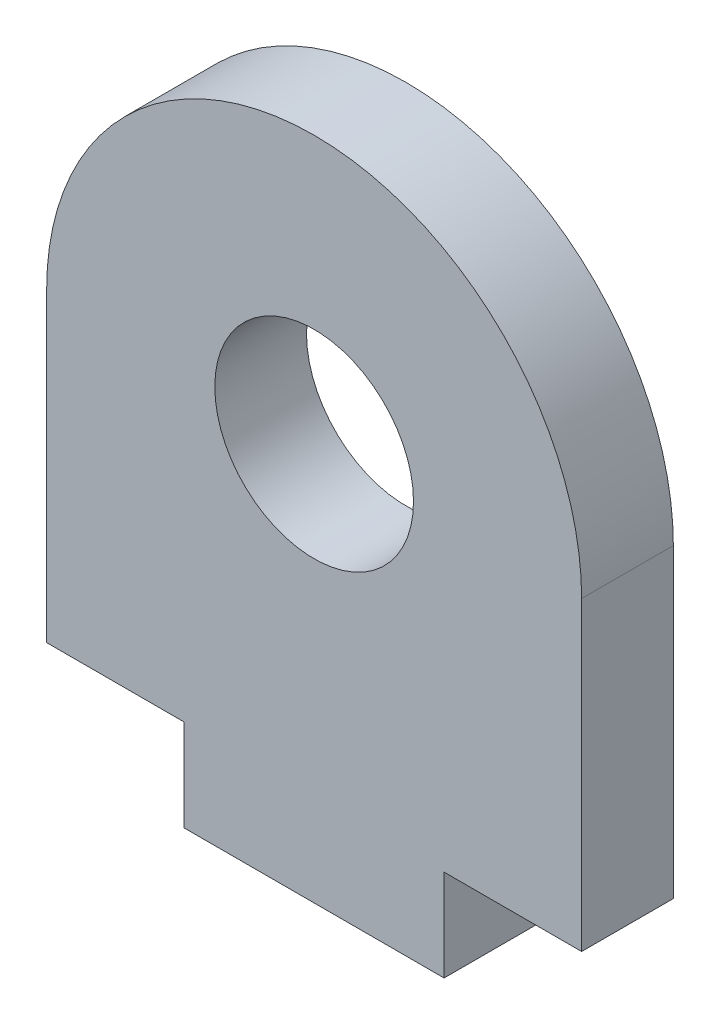
ISO-10303-21;
HEADER;
FILE_DESCRIPTION(('STEP AP214'),'2;1');
FILE_NAME('part.step','',(''),(''),'','','');
FILE_SCHEMA(('AUTOMOTIVE_DESIGN { 1 0 10303 214 1 1 1 1 }'));
ENDSEC;
DATA;
#1=APPLICATION_CONTEXT('core data for automotive mechanical design processes');
#2=APPLICATION_PROTOCOL_DEFINITION('international standard','automotive_design',2000,#1);
#3=PRODUCT_CONTEXT('',#1,'mechanical');
#4=PRODUCT('Part','Part','',(#3));
#5=PRODUCT_RELATED_PRODUCT_CATEGORY('part','',(#4));
#6=PRODUCT_DEFINITION_FORMATION('','',#4);
#7=PRODUCT_DEFINITION_CONTEXT('part definition',#1,'design');
#8=PRODUCT_DEFINITION('design','',#6,#7);
#9=PRODUCT_DEFINITION_SHAPE('','',#8);
#10=(LENGTH_UNIT() NAMED_UNIT(*) SI_UNIT(.MILLI.,.METRE.));
#11=(NAMED_UNIT(*) PLANE_ANGLE_UNIT() SI_UNIT($,.RADIAN.));
#12=(NAMED_UNIT(*) SI_UNIT($,.STERADIAN.) SOLID_ANGLE_UNIT());
#13=UNCERTAINTY_MEASURE_WITH_UNIT(LENGTH_MEASURE(1.E-05),#10,'distance_accuracy_value','');
#14=(GEOMETRIC_REPRESENTATION_CONTEXT(3) GLOBAL_UNCERTAINTY_ASSIGNED_CONTEXT((#13)) GLOBAL_UNIT_ASSIGNED_CONTEXT((#10,
#11,#12)) REPRESENTATION_CONTEXT('',''));
#15=CARTESIAN_POINT('',(0.,0.,0.));
#16=DIRECTION('',(0.,0.,1.));
#17=DIRECTION('',(1.,0.,0.));
#18=AXIS2_PLACEMENT_3D('',#15,#16,#17);
#19=CARTESIAN_POINT('',(0.,0.,6.));
#20=DIRECTION('',(0.,0.,1.));
#21=DIRECTION('',(1.,0.,0.));
#22=AXIS2_PLACEMENT_3D('',#19,#20,#21);
#23=PLANE('',#22);
#24=CARTESIAN_POINT('',(0.,0.,6.));
#25=DIRECTION('',(0.,0.,1.));
#26=DIRECTION('',(1.,0.,0.));
#27=AXIS2_PLACEMENT_3D('',#24,#25,#26);
#28=CIRCLE('',#27,17.5);
#29=CARTESIAN_POINT('',(17.5,0.,6.));
#30=VERTEX_POINT('',#29);
#31=CARTESIAN_POINT('',(-17.5,0.,6.));
#32=VERTEX_POINT('',#31);
#33=EDGE_CURVE('E147',#30,#32,#28,.T.);
#34=ORIENTED_EDGE('',*,*,#33,.T.);
#35=DIRECTION('',(0.,-1.,0.));
#36=VECTOR('',#35,1.);
#37=CARTESIAN_POINT('',(-17.5,0.,6.));
#38=LINE('',#37,#36);
#39=CARTESIAN_POINT('',(-17.5,-20.,6.));
#40=VERTEX_POINT('',#39);
#41=EDGE_CURVE('E95',#32,#40,#38,.T.);
#42=ORIENTED_EDGE('',*,*,#41,.T.);
#43=DIRECTION('',(1.,0.,0.));
#44=VECTOR('',#43,1.);
#45=CARTESIAN_POINT('',(-17.5,-20.,6.));
#46=LINE('',#45,#44);
#47=CARTESIAN_POINT('',(-8.5,-20.,6.));
#48=VERTEX_POINT('',#47);
#49=EDGE_CURVE('E162',#40,#48,#46,.T.);
#50=ORIENTED_EDGE('',*,*,#49,.T.);
#51=DIRECTION('',(0.,-1.,0.));
#52=VECTOR('',#51,1.);
#53=CARTESIAN_POINT('',(-8.5,-20.,6.));
#54=LINE('',#53,#52);
#55=CARTESIAN_POINT('',(-8.5,-26.,6.));
#56=VERTEX_POINT('',#55);
#57=EDGE_CURVE('E175',#48,#56,#54,.T.);
#58=ORIENTED_EDGE('',*,*,#57,.T.);
#59=DIRECTION('',(1.,0.,0.));
#60=VECTOR('',#59,1.);
#61=CARTESIAN_POINT('',(-8.5,-26.,6.));
#62=LINE('',#61,#60);
#63=CARTESIAN_POINT('',(8.5,-26.,6.));
#64=VERTEX_POINT('',#63);
#65=EDGE_CURVE('E114',#56,#64,#62,.T.);
#66=ORIENTED_EDGE('',*,*,#65,.T.);
#67=DIRECTION('',(0.,1.,0.));
#68=VECTOR('',#67,1.);
#69=CARTESIAN_POINT('',(8.5,-26.,6.));
#70=LINE('',#69,#68);
#71=CARTESIAN_POINT('',(8.50000000000001,-20.,6.));
#72=VERTEX_POINT('',#71);
#73=EDGE_CURVE('E108',#64,#72,#70,.T.);
#74=ORIENTED_EDGE('',*,*,#73,.T.);
#75=DIRECTION('',(1.,0.,0.));
#76=VECTOR('',#75,1.);
#77=CARTESIAN_POINT('',(8.50000000000001,-20.,6.));
#78=LINE('',#77,#76);
#79=CARTESIAN_POINT('',(17.5,-20.,6.));
#80=VERTEX_POINT('',#79);
#81=EDGE_CURVE('E112',#72,#80,#78,.T.);
#82=ORIENTED_EDGE('',*,*,#81,.T.);
#83=DIRECTION('',(0.,1.,0.));
#84=VECTOR('',#83,1.);
#85=CARTESIAN_POINT('',(17.5,-20.,6.));
#86=LINE('',#85,#84);
#87=EDGE_CURVE('E52',#80,#30,#86,.T.);
#88=ORIENTED_EDGE('',*,*,#87,.T.);
#89=EDGE_LOOP('',(#34,#42,#50,#58,#66,#74,#82,#88));
#90=FACE_BOUND('',#89,.T.);
#91=CARTESIAN_POINT('',(0.,0.,6.));
#92=DIRECTION('',(0.,0.,1.));
#93=DIRECTION('',(1.,0.,0.));
#94=AXIS2_PLACEMENT_3D('',#91,#92,#93);
#95=CIRCLE('',#94,6.5);
#96=CARTESIAN_POINT('',(6.5,0.,6.));
#97=VERTEX_POINT('',#96);
#98=EDGE_CURVE('E136',#97,#97,#95,.T.);
#99=ORIENTED_EDGE('',*,*,#98,.F.);
#100=EDGE_LOOP('',(#99));
#101=FACE_BOUND('',#100,.T.);
#102=ADVANCED_FACE('F35',(#90,#101),#23,.T.);
#103=CARTESIAN_POINT('',(0.,0.,0.));
#104=DIRECTION('',(0.,0.,1.));
#105=DIRECTION('',(1.,0.,0.));
#106=AXIS2_PLACEMENT_3D('',#103,#104,#105);
#107=PLANE('',#106);
#108=CARTESIAN_POINT('',(0.,0.,0.));
#109=DIRECTION('',(0.,0.,1.));
#110=DIRECTION('',(1.,0.,0.));
#111=AXIS2_PLACEMENT_3D('',#108,#109,#110);
#112=CIRCLE('',#111,17.5);
#113=CARTESIAN_POINT('',(17.5,0.,0.));
#114=VERTEX_POINT('',#113);
#115=CARTESIAN_POINT('',(-17.5,0.,0.));
#116=VERTEX_POINT('',#115);
#117=EDGE_CURVE('E132',#114,#116,#112,.T.);
#118=ORIENTED_EDGE('',*,*,#117,.F.);
#119=DIRECTION('',(0.,1.,0.));
#120=VECTOR('',#119,1.);
#121=CARTESIAN_POINT('',(17.5,-20.,0.));
#122=LINE('',#121,#120);
#123=CARTESIAN_POINT('',(17.5,-20.,0.));
#124=VERTEX_POINT('',#123);
#125=EDGE_CURVE('E87',#124,#114,#122,.T.);
#126=ORIENTED_EDGE('',*,*,#125,.F.);
#127=DIRECTION('',(1.,0.,0.));
#128=VECTOR('',#127,1.);
#129=CARTESIAN_POINT('',(8.50000000000001,-20.,0.));
#130=LINE('',#129,#128);
#131=CARTESIAN_POINT('',(8.50000000000001,-20.,0.));
#132=VERTEX_POINT('',#131);
#133=EDGE_CURVE('E81',#132,#124,#130,.T.);
#134=ORIENTED_EDGE('',*,*,#133,.F.);
#135=DIRECTION('',(0.,1.,0.));
#136=VECTOR('',#135,1.);
#137=CARTESIAN_POINT('',(8.5,-26.,0.));
#138=LINE('',#137,#136);
#139=CARTESIAN_POINT('',(8.5,-26.,0.));
#140=VERTEX_POINT('',#139);
#141=EDGE_CURVE('E122',#140,#132,#138,.T.);
#142=ORIENTED_EDGE('',*,*,#141,.F.);
#143=DIRECTION('',(1.,0.,0.));
#144=VECTOR('',#143,1.);
#145=CARTESIAN_POINT('',(-8.5,-26.,0.));
#146=LINE('',#145,#144);
#147=CARTESIAN_POINT('',(-8.5,-26.,0.));
#148=VERTEX_POINT('',#147);
#149=EDGE_CURVE('E142',#148,#140,#146,.T.);
#150=ORIENTED_EDGE('',*,*,#149,.F.);
#151=DIRECTION('',(0.,-1.,0.));
#152=VECTOR('',#151,1.);
#153=CARTESIAN_POINT('',(-8.5,-20.,0.));
#154=LINE('',#153,#152);
#155=CARTESIAN_POINT('',(-8.5,-20.,0.));
#156=VERTEX_POINT('',#155);
#157=EDGE_CURVE('E140',#156,#148,#154,.T.);
#158=ORIENTED_EDGE('',*,*,#157,.F.);
#159=DIRECTION('',(1.,0.,0.));
#160=VECTOR('',#159,1.);
#161=CARTESIAN_POINT('',(-17.5,-20.,0.));
#162=LINE('',#161,#160);
#163=CARTESIAN_POINT('',(-17.5,-20.,0.));
#164=VERTEX_POINT('',#163);
#165=EDGE_CURVE('E138',#164,#156,#162,.T.);
#166=ORIENTED_EDGE('',*,*,#165,.F.);
#167=DIRECTION('',(0.,-1.,0.));
#168=VECTOR('',#167,1.);
#169=CARTESIAN_POINT('',(-17.5,0.,0.));
#170=LINE('',#169,#168);
#171=EDGE_CURVE('E135',#116,#164,#170,.T.);
#172=ORIENTED_EDGE('',*,*,#171,.F.);
#173=EDGE_LOOP('',(#118,#126,#134,#142,#150,#158,#166,#172));
#174=FACE_BOUND('',#173,.T.);
#175=CARTESIAN_POINT('',(0.,0.,0.));
#176=DIRECTION('',(0.,0.,1.));
#177=DIRECTION('',(1.,0.,0.));
#178=AXIS2_PLACEMENT_3D('',#175,#176,#177);
#179=CIRCLE('',#178,6.5);
#180=CARTESIAN_POINT('',(6.5,0.,0.));
#181=VERTEX_POINT('',#180);
#182=EDGE_CURVE('E181',#181,#181,#179,.T.);
#183=ORIENTED_EDGE('',*,*,#182,.T.);
#184=EDGE_LOOP('',(#183));
#185=FACE_BOUND('',#184,.T.);
#186=ADVANCED_FACE('F166',(#174,#185),#107,.F.);
#187=CARTESIAN_POINT('',(0.,0.,6.));
#188=DIRECTION('',(0.,0.,-1.));
#189=DIRECTION('',(-1.,0.,0.));
#190=AXIS2_PLACEMENT_3D('',#187,#188,#189);
#191=CYLINDRICAL_SURFACE('',#190,17.5);
#192=ORIENTED_EDGE('',*,*,#117,.T.);
#193=DIRECTION('',(0.,0.,-1.));
#194=VECTOR('',#193,1.);
#195=CARTESIAN_POINT('',(-17.5,0.,6.));
#196=LINE('',#195,#194);
#197=EDGE_CURVE('E11',#32,#116,#196,.T.);
#198=ORIENTED_EDGE('',*,*,#197,.F.);
#199=ORIENTED_EDGE('',*,*,#33,.F.);
#200=DIRECTION('',(0.,0.,-1.));
#201=VECTOR('',#200,1.);
#202=CARTESIAN_POINT('',(17.5,0.,6.));
#203=LINE('',#202,#201);
#204=EDGE_CURVE('E128',#30,#114,#203,.T.);
#205=ORIENTED_EDGE('',*,*,#204,.T.);
#206=EDGE_LOOP('',(#192,#198,#199,#205));
#207=FACE_BOUND('',#206,.T.);
#208=ADVANCED_FACE('F37',(#207),#191,.T.);
#209=CARTESIAN_POINT('',(-17.5,0.,6.));
#210=DIRECTION('',(1.,0.,0.));
#211=DIRECTION('',(0.,1.,0.));
#212=AXIS2_PLACEMENT_3D('',#209,#210,#211);
#213=PLANE('',#212);
#214=ORIENTED_EDGE('',*,*,#171,.T.);
#215=DIRECTION('',(0.,0.,-1.));
#216=VECTOR('',#215,1.);
#217=CARTESIAN_POINT('',(-17.5,-20.,6.));
#218=LINE('',#217,#216);
#219=EDGE_CURVE('E44',#40,#164,#218,.T.);
#220=ORIENTED_EDGE('',*,*,#219,.F.);
#221=ORIENTED_EDGE('',*,*,#41,.F.);
#222=ORIENTED_EDGE('',*,*,#197,.T.);
#223=EDGE_LOOP('',(#214,#220,#221,#222));
#224=FACE_BOUND('',#223,.T.);
#225=ADVANCED_FACE('F209',(#224),#213,.F.);
#226=CARTESIAN_POINT('',(-17.5,-20.,6.));
#227=DIRECTION('',(0.,1.,0.));
#228=DIRECTION('',(-1.,0.,0.));
#229=AXIS2_PLACEMENT_3D('',#226,#227,#228);
#230=PLANE('',#229);
#231=ORIENTED_EDGE('',*,*,#165,.T.);
#232=DIRECTION('',(0.,0.,-1.));
#233=VECTOR('',#232,1.);
#234=CARTESIAN_POINT('',(-8.5,-20.,6.));
#235=LINE('',#234,#233);
#236=EDGE_CURVE('E154',#48,#156,#235,.T.);
#237=ORIENTED_EDGE('',*,*,#236,.F.);
#238=ORIENTED_EDGE('',*,*,#49,.F.);
#239=ORIENTED_EDGE('',*,*,#219,.T.);
#240=EDGE_LOOP('',(#231,#237,#238,#239));
#241=FACE_BOUND('',#240,.T.);
#242=ADVANCED_FACE('F160',(#241),#230,.F.);
#243=CARTESIAN_POINT('',(-8.5,-20.,6.));
#244=DIRECTION('',(1.,0.,0.));
#245=DIRECTION('',(0.,1.,0.));
#246=AXIS2_PLACEMENT_3D('',#243,#244,#245);
#247=PLANE('',#246);
#248=ORIENTED_EDGE('',*,*,#157,.T.);
#249=DIRECTION('',(0.,0.,-1.));
#250=VECTOR('',#249,1.);
#251=CARTESIAN_POINT('',(-8.5,-26.,6.));
#252=LINE('',#251,#250);
#253=EDGE_CURVE('E151',#56,#148,#252,.T.);
#254=ORIENTED_EDGE('',*,*,#253,.F.);
#255=ORIENTED_EDGE('',*,*,#57,.F.);
#256=ORIENTED_EDGE('',*,*,#236,.T.);
#257=EDGE_LOOP('',(#248,#254,#255,#256));
#258=FACE_BOUND('',#257,.T.);
#259=ADVANCED_FACE('F171',(#258),#247,.F.);
#260=CARTESIAN_POINT('',(-8.5,-26.,6.));
#261=DIRECTION('',(0.,1.,0.));
#262=DIRECTION('',(-1.,0.,0.));
#263=AXIS2_PLACEMENT_3D('',#260,#261,#262);
#264=PLANE('',#263);
#265=ORIENTED_EDGE('',*,*,#149,.T.);
#266=DIRECTION('',(0.,0.,-1.));
#267=VECTOR('',#266,1.);
#268=CARTESIAN_POINT('',(8.5,-26.,6.));
#269=LINE('',#268,#267);
#270=EDGE_CURVE('E123',#64,#140,#269,.T.);
#271=ORIENTED_EDGE('',*,*,#270,.F.);
#272=ORIENTED_EDGE('',*,*,#65,.F.);
#273=ORIENTED_EDGE('',*,*,#253,.T.);
#274=EDGE_LOOP('',(#265,#271,#272,#273));
#275=FACE_BOUND('',#274,.T.);
#276=ADVANCED_FACE('F174',(#275),#264,.F.);
#277=CARTESIAN_POINT('',(8.5,-26.,6.));
#278=DIRECTION('',(-1.,0.,0.));
#279=DIRECTION('',(0.,-1.,0.));
#280=AXIS2_PLACEMENT_3D('',#277,#278,#279);
#281=PLANE('',#280);
#282=ORIENTED_EDGE('',*,*,#141,.T.);
#283=DIRECTION('',(0.,0.,-1.));
#284=VECTOR('',#283,1.);
#285=CARTESIAN_POINT('',(8.50000000000001,-20.,6.));
#286=LINE('',#285,#284);
#287=EDGE_CURVE('E119',#72,#132,#286,.T.);
#288=ORIENTED_EDGE('',*,*,#287,.F.);
#289=ORIENTED_EDGE('',*,*,#73,.F.);
#290=ORIENTED_EDGE('',*,*,#270,.T.);
#291=EDGE_LOOP('',(#282,#288,#289,#290));
#292=FACE_BOUND('',#291,.T.);
#293=ADVANCED_FACE('F120',(#292),#281,.F.);
#294=CARTESIAN_POINT('',(8.50000000000001,-20.,6.));
#295=DIRECTION('',(0.,1.,0.));
#296=DIRECTION('',(0.,0.,1.));
#297=AXIS2_PLACEMENT_3D('',#294,#295,#296);
#298=PLANE('',#297);
#299=ORIENTED_EDGE('',*,*,#133,.T.);
#300=DIRECTION('',(0.,0.,-1.));
#301=VECTOR('',#300,1.);
#302=CARTESIAN_POINT('',(17.5,-20.,6.));
#303=LINE('',#302,#301);
#304=EDGE_CURVE('E124',#80,#124,#303,.T.);
#305=ORIENTED_EDGE('',*,*,#304,.F.);
#306=ORIENTED_EDGE('',*,*,#81,.F.);
#307=ORIENTED_EDGE('',*,*,#287,.T.);
#308=EDGE_LOOP('',(#299,#305,#306,#307));
#309=FACE_BOUND('',#308,.T.);
#310=ADVANCED_FACE('F126',(#309),#298,.F.);
#311=CARTESIAN_POINT('',(17.5,-20.,6.));
#312=DIRECTION('',(-1.,0.,0.));
#313=DIRECTION('',(0.,0.,1.));
#314=AXIS2_PLACEMENT_3D('',#311,#312,#313);
#315=PLANE('',#314);
#316=ORIENTED_EDGE('',*,*,#125,.T.);
#317=ORIENTED_EDGE('',*,*,#204,.F.);
#318=ORIENTED_EDGE('',*,*,#87,.F.);
#319=ORIENTED_EDGE('',*,*,#304,.T.);
#320=EDGE_LOOP('',(#316,#317,#318,#319));
#321=FACE_BOUND('',#320,.T.);
#322=ADVANCED_FACE('F197',(#321),#315,.F.);
#323=CARTESIAN_POINT('',(0.,0.,6.));
#324=DIRECTION('',(0.,0.,-1.));
#325=DIRECTION('',(-1.,0.,0.));
#326=AXIS2_PLACEMENT_3D('',#323,#324,#325);
#327=CYLINDRICAL_SURFACE('',#326,6.5);
#328=ORIENTED_EDGE('',*,*,#98,.T.);
#329=EDGE_LOOP('',(#328));
#330=FACE_BOUND('',#329,.T.);
#331=ORIENTED_EDGE('',*,*,#182,.F.);
#332=EDGE_LOOP('',(#331));
#333=FACE_BOUND('',#332,.T.);
#334=ADVANCED_FACE('F187',(#330,#333),#327,.F.);
#335=CLOSED_SHELL('',(#102,#186,#208,#225,#242,#259,#276,#293,#310,#322,#334));
#336=MANIFOLD_SOLID_BREP('B2',#335);
#337=ADVANCED_BREP_SHAPE_REPRESENTATION('',(#18,#336),#14);
#338=SHAPE_DEFINITION_REPRESENTATION(#9,#337);
ENDSEC;
END-ISO-10303-21;
